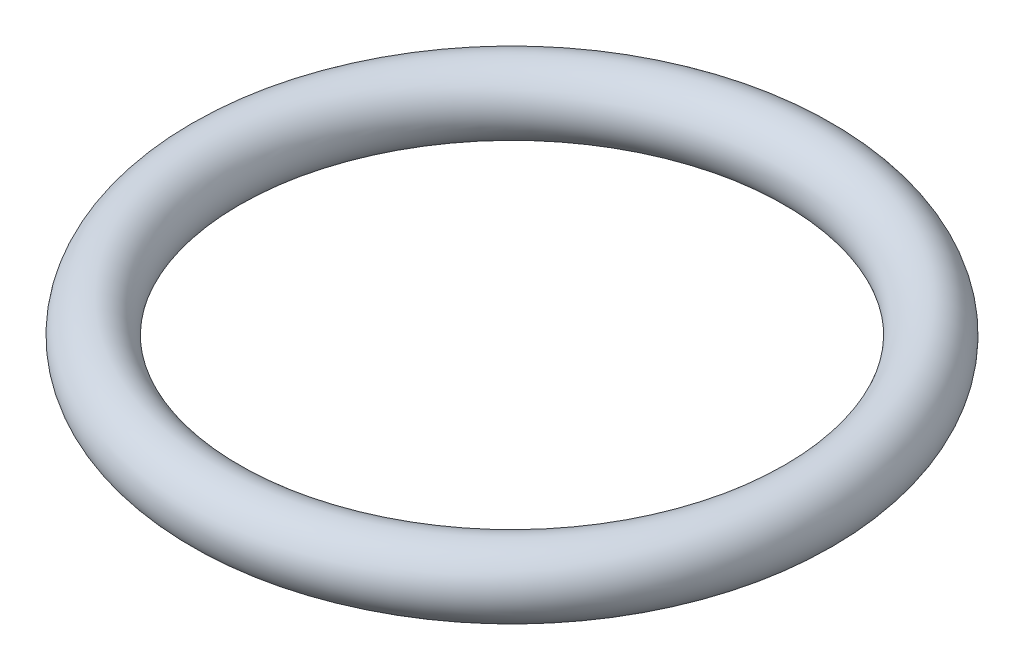
ISO-10303-21;
HEADER;
FILE_DESCRIPTION(('STEP AP214'),'2;1');
FILE_NAME('part.step','',(''),(''),'','','');
FILE_SCHEMA(('AUTOMOTIVE_DESIGN { 1 0 10303 214 1 1 1 1 }'));
ENDSEC;
DATA;
#1=APPLICATION_CONTEXT('core data for automotive mechanical design processes');
#2=APPLICATION_PROTOCOL_DEFINITION('international standard','automotive_design',2000,#1);
#3=PRODUCT_CONTEXT('',#1,'mechanical');
#4=PRODUCT('Part','Part','',(#3));
#5=PRODUCT_RELATED_PRODUCT_CATEGORY('part','',(#4));
#6=PRODUCT_DEFINITION_FORMATION('','',#4);
#7=PRODUCT_DEFINITION_CONTEXT('part definition',#1,'design');
#8=PRODUCT_DEFINITION('design','',#6,#7);
#9=PRODUCT_DEFINITION_SHAPE('','',#8);
#10=(LENGTH_UNIT() NAMED_UNIT(*) SI_UNIT(.MILLI.,.METRE.));
#11=(NAMED_UNIT(*) PLANE_ANGLE_UNIT() SI_UNIT($,.RADIAN.));
#12=(NAMED_UNIT(*) SI_UNIT($,.STERADIAN.) SOLID_ANGLE_UNIT());
#13=UNCERTAINTY_MEASURE_WITH_UNIT(LENGTH_MEASURE(1.E-05),#10,'distance_accuracy_value','');
#14=(GEOMETRIC_REPRESENTATION_CONTEXT(3) GLOBAL_UNCERTAINTY_ASSIGNED_CONTEXT((#13)) GLOBAL_UNIT_ASSIGNED_CONTEXT((#10,
#11,#12)) REPRESENTATION_CONTEXT('',''));
#15=CARTESIAN_POINT('',(0.,0.,0.));
#16=DIRECTION('',(0.,0.,1.));
#17=DIRECTION('',(1.,0.,0.));
#18=AXIS2_PLACEMENT_3D('',#15,#16,#17);
#19=CARTESIAN_POINT('',(0.,0.,0.));
#20=DIRECTION('',(0.,1.,0.));
#21=DIRECTION('',(-1.,0.,0.));
#22=AXIS2_PLACEMENT_3D('',#19,#20,#21);
#23=TOROIDAL_SURFACE('',#22,7.8867,0.889000000000002);
#24=CARTESIAN_POINT('',(-8.7757,0.,0.));
#25=VERTEX_POINT('',#24);
#26=VERTEX_LOOP('',#25);
#27=FACE_BOUND('',#26,.T.);
#28=ADVANCED_FACE('F30',(#27),#23,.T.);
#29=CLOSED_SHELL('',(#28));
#30=MANIFOLD_SOLID_BREP('B2',#29);
#31=ADVANCED_BREP_SHAPE_REPRESENTATION('',(#18,#30),#14);
#32=SHAPE_DEFINITION_REPRESENTATION(#9,#31);
ENDSEC;
END-ISO-10303-21;
